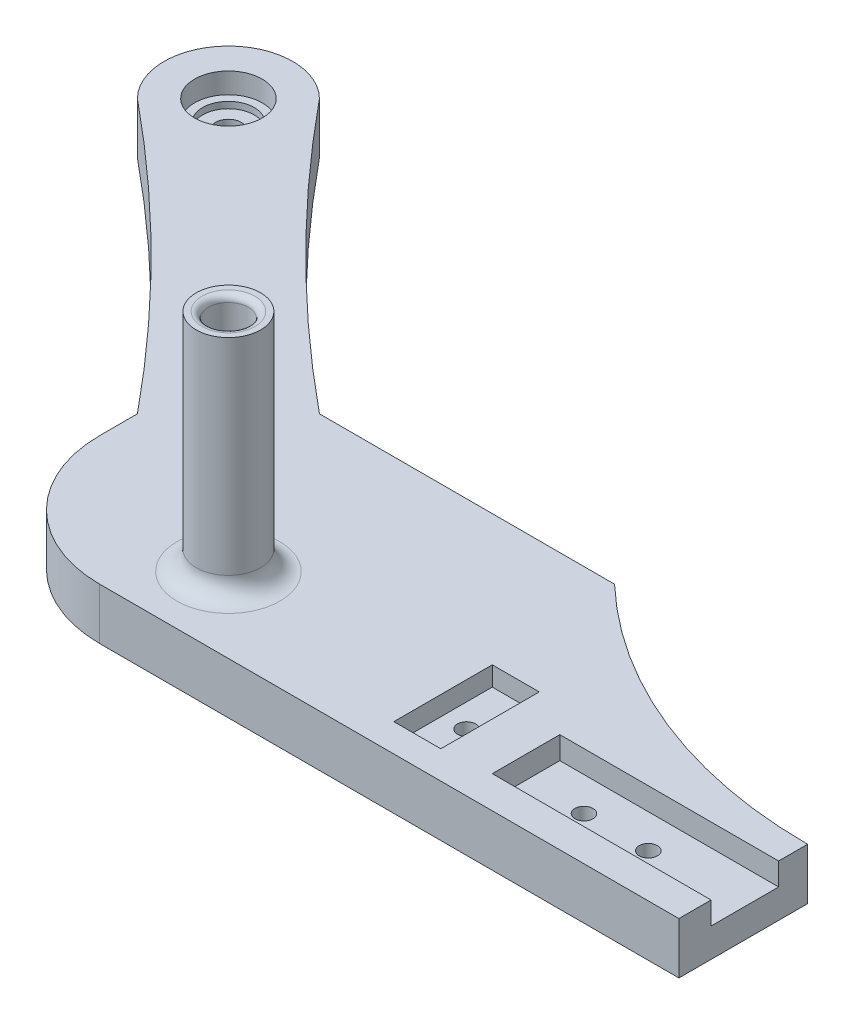
ISO-10303-21;
HEADER;
FILE_DESCRIPTION(('STEP AP214'),'2;1');
FILE_NAME('part.step','',(''),(''),'','','');
FILE_SCHEMA(('AUTOMOTIVE_DESIGN { 1 0 10303 214 1 1 1 1 }'));
ENDSEC;
DATA;
#1=APPLICATION_CONTEXT('core data for automotive mechanical design processes');
#2=APPLICATION_PROTOCOL_DEFINITION('international standard','automotive_design',2000,#1);
#3=PRODUCT_CONTEXT('',#1,'mechanical');
#4=PRODUCT('Part','Part','',(#3));
#5=PRODUCT_RELATED_PRODUCT_CATEGORY('part','',(#4));
#6=PRODUCT_DEFINITION_FORMATION('','',#4);
#7=PRODUCT_DEFINITION_CONTEXT('part definition',#1,'design');
#8=PRODUCT_DEFINITION('design','',#6,#7);
#9=PRODUCT_DEFINITION_SHAPE('','',#8);
#10=(LENGTH_UNIT() NAMED_UNIT(*) SI_UNIT(.MILLI.,.METRE.));
#11=(NAMED_UNIT(*) PLANE_ANGLE_UNIT() SI_UNIT($,.RADIAN.));
#12=(NAMED_UNIT(*) SI_UNIT($,.STERADIAN.) SOLID_ANGLE_UNIT());
#13=UNCERTAINTY_MEASURE_WITH_UNIT(LENGTH_MEASURE(1.E-05),#10,'distance_accuracy_value','');
#14=(GEOMETRIC_REPRESENTATION_CONTEXT(3) GLOBAL_UNCERTAINTY_ASSIGNED_CONTEXT((#13)) GLOBAL_UNIT_ASSIGNED_CONTEXT((#10,
#11,#12)) REPRESENTATION_CONTEXT('',''));
#15=CARTESIAN_POINT('',(0.,0.,0.));
#16=DIRECTION('',(0.,0.,1.));
#17=DIRECTION('',(1.,0.,0.));
#18=AXIS2_PLACEMENT_3D('',#15,#16,#17);
#19=CARTESIAN_POINT('',(-200.355339059327,8.,-55.3553390593275));
#20=DIRECTION('',(0.,1.,0.));
#21=DIRECTION('',(0.,0.,1.));
#22=AXIS2_PLACEMENT_3D('',#19,#20,#21);
#23=PLANE('',#22);
#24=DIRECTION('',(0.,0.,-1.));
#25=VECTOR('',#24,1.);
#26=CARTESIAN_POINT('',(-96.35,8.,15.65));
#27=LINE('',#26,#25);
#28=CARTESIAN_POINT('',(-96.35,8.,15.65));
#29=VERTEX_POINT('',#28);
#30=CARTESIAN_POINT('',(-96.35,8.,0.350000000000003));
#31=VERTEX_POINT('',#30);
#32=EDGE_CURVE('E56',#29,#31,#27,.T.);
#33=ORIENTED_EDGE('',*,*,#32,.F.);
#34=DIRECTION('',(1.,0.,0.));
#35=VECTOR('',#34,1.);
#36=CARTESIAN_POINT('',(-103.65,8.,15.65));
#37=LINE('',#36,#35);
#38=CARTESIAN_POINT('',(-103.65,8.,15.65));
#39=VERTEX_POINT('',#38);
#40=EDGE_CURVE('E184',#39,#29,#37,.T.);
#41=ORIENTED_EDGE('',*,*,#40,.F.);
#42=DIRECTION('',(0.,0.,1.));
#43=VECTOR('',#42,1.);
#44=CARTESIAN_POINT('',(-103.65,8.,15.65));
#45=LINE('',#44,#43);
#46=CARTESIAN_POINT('',(-103.65,8.,0.350000000000002));
#47=VERTEX_POINT('',#46);
#48=EDGE_CURVE('E188',#47,#39,#45,.T.);
#49=ORIENTED_EDGE('',*,*,#48,.F.);
#50=DIRECTION('',(-1.,0.,0.));
#51=VECTOR('',#50,1.);
#52=CARTESIAN_POINT('',(-103.65,8.,0.350000000000002));
#53=LINE('',#52,#51);
#54=EDGE_CURVE('E200',#31,#47,#53,.T.);
#55=ORIENTED_EDGE('',*,*,#54,.F.);
#56=EDGE_LOOP('',(#33,#41,#49,#55));
#57=FACE_BOUND('',#56,.T.);
#58=CARTESIAN_POINT('',(-136.715728752538,8.,8.28427124746194));
#59=DIRECTION('',(0.,1.,0.));
#60=DIRECTION('',(0.,0.,1.));
#61=AXIS2_PLACEMENT_3D('',#58,#59,#60);
#62=CIRCLE('',#61,8.00000000000002);
#63=CARTESIAN_POINT('',(-136.715728752538,8.,16.284271247462));
#64=VERTEX_POINT('',#63);
#65=EDGE_CURVE('E409',#64,#64,#62,.F.);
#66=ORIENTED_EDGE('',*,*,#65,.T.);
#67=EDGE_LOOP('',(#66));
#68=FACE_BOUND('',#67,.T.);
#69=DIRECTION('',(-1.,0.,0.));
#70=VECTOR('',#69,1.);
#71=CARTESIAN_POINT('',(-55.,8.,20.));
#72=LINE('',#71,#70);
#73=CARTESIAN_POINT('',(-55.,8.,20.));
#74=VERTEX_POINT('',#73);
#75=CARTESIAN_POINT('',(-145.,8.,20.));
#76=VERTEX_POINT('',#75);
#77=EDGE_CURVE('E334',#74,#76,#72,.T.);
#78=ORIENTED_EDGE('',*,*,#77,.F.);
#79=DIRECTION('',(0.,0.,1.));
#80=VECTOR('',#79,1.);
#81=CARTESIAN_POINT('',(-55.,8.,20.));
#82=LINE('',#81,#80);
#83=CARTESIAN_POINT('',(-55.,8.,15.));
#84=VERTEX_POINT('',#83);
#85=EDGE_CURVE('E335',#84,#74,#82,.T.);
#86=ORIENTED_EDGE('',*,*,#85,.F.);
#87=DIRECTION('',(-1.,0.,0.));
#88=VECTOR('',#87,1.);
#89=CARTESIAN_POINT('',(-55.,8.,15.));
#90=LINE('',#89,#88);
#91=CARTESIAN_POINT('',(-89.,8.,15.));
#92=VERTEX_POINT('',#91);
#93=EDGE_CURVE('E247',#84,#92,#90,.T.);
#94=ORIENTED_EDGE('',*,*,#93,.T.);
#95=DIRECTION('',(0.,0.,-1.));
#96=VECTOR('',#95,1.);
#97=CARTESIAN_POINT('',(-89.,8.,15.));
#98=LINE('',#97,#96);
#99=CARTESIAN_POINT('',(-89.,8.,4.5));
#100=VERTEX_POINT('',#99);
#101=EDGE_CURVE('E251',#92,#100,#98,.T.);
#102=ORIENTED_EDGE('',*,*,#101,.T.);
#103=DIRECTION('',(1.,0.,0.));
#104=VECTOR('',#103,1.);
#105=CARTESIAN_POINT('',(-55.,8.,4.5));
#106=LINE('',#105,#104);
#107=CARTESIAN_POINT('',(-55.,8.,4.5));
#108=VERTEX_POINT('',#107);
#109=EDGE_CURVE('E237',#100,#108,#106,.T.);
#110=ORIENTED_EDGE('',*,*,#109,.T.);
#111=CARTESIAN_POINT('',(-55.,8.,0.));
#112=VERTEX_POINT('',#111);
#113=EDGE_CURVE('E330',#112,#108,#82,.T.);
#114=ORIENTED_EDGE('',*,*,#113,.F.);
#115=CARTESIAN_POINT('',(-55.,8.,-72.5));
#116=DIRECTION('',(0.,-1.,0.));
#117=DIRECTION('',(0.,0.,-1.));
#118=AXIS2_PLACEMENT_3D('',#115,#116,#117);
#119=CIRCLE('',#118,72.5);
#120=CARTESIAN_POINT('',(-105.,8.,-20.));
#121=VERTEX_POINT('',#120);
#122=EDGE_CURVE('E262',#112,#121,#119,.T.);
#123=ORIENTED_EDGE('',*,*,#122,.T.);
#124=DIRECTION('',(1.,0.,0.));
#125=VECTOR('',#124,1.);
#126=CARTESIAN_POINT('',(-55.,8.,-20.));
#127=LINE('',#126,#125);
#128=CARTESIAN_POINT('',(-150.857864376269,8.,-20.));
#129=VERTEX_POINT('',#128);
#130=EDGE_CURVE('E347',#129,#121,#127,.T.);
#131=ORIENTED_EDGE('',*,*,#130,.F.);
#132=CARTESIAN_POINT('',(38.9976413801893,8.,-252.28191262765));
#133=DIRECTION('',(0.,-1.,0.));
#134=DIRECTION('',(0.,0.,-1.));
#135=AXIS2_PLACEMENT_3D('',#132,#133,#134);
#136=CIRCLE('',#135,300.);
#137=CARTESIAN_POINT('',(-193.284271247462,8.,-62.4264068711929));
#138=VERTEX_POINT('',#137);
#139=EDGE_CURVE('E318',#129,#138,#136,.T.);
#140=ORIENTED_EDGE('',*,*,#139,.T.);
#141=CARTESIAN_POINT('',(-200.355339059327,8.,-55.3553390593275));
#142=DIRECTION('',(0.,-1.,0.));
#143=DIRECTION('',(0.,0.,1.));
#144=AXIS2_PLACEMENT_3D('',#141,#142,#143);
#145=CIRCLE('',#144,10.);
#146=CARTESIAN_POINT('',(-207.426406871193,8.,-48.2842712474621));
#147=VERTEX_POINT('',#146);
#148=EDGE_CURVE('E343',#147,#138,#145,.T.);
#149=ORIENTED_EDGE('',*,*,#148,.F.);
#150=CARTESIAN_POINT('',(-397.281912627651,8.,183.997641380188));
#151=DIRECTION('',(0.,1.,0.));
#152=DIRECTION('',(-1.,0.,0.));
#153=AXIS2_PLACEMENT_3D('',#150,#151,#152);
#154=CIRCLE('',#153,300.);
#155=CARTESIAN_POINT('',(-165.,8.,-5.85786437626911));
#156=VERTEX_POINT('',#155);
#157=EDGE_CURVE('E310',#156,#147,#154,.T.);
#158=ORIENTED_EDGE('',*,*,#157,.F.);
#159=DIRECTION('',(0.,0.,-1.));
#160=VECTOR('',#159,1.);
#161=CARTESIAN_POINT('',(-165.,8.,20.));
#162=LINE('',#161,#160);
#163=CARTESIAN_POINT('',(-165.,8.,0.));
#164=VERTEX_POINT('',#163);
#165=EDGE_CURVE('E339',#164,#156,#162,.T.);
#166=ORIENTED_EDGE('',*,*,#165,.F.);
#167=CARTESIAN_POINT('',(-145.,8.,0.));
#168=DIRECTION('',(0.,-1.,0.));
#169=DIRECTION('',(0.,0.,1.));
#170=AXIS2_PLACEMENT_3D('',#167,#168,#169);
#171=CIRCLE('',#170,20.);
#172=EDGE_CURVE('E396',#76,#164,#171,.T.);
#173=ORIENTED_EDGE('',*,*,#172,.F.);
#174=EDGE_LOOP('',(#78,#86,#94,#102,#110,#114,#123,#131,#140,#149,#158,#166,#173));
#175=FACE_BOUND('',#174,.T.);
#176=CARTESIAN_POINT('',(-200.355339059327,8.,-55.3553390593275));
#177=DIRECTION('',(0.,-1.,0.));
#178=DIRECTION('',(0.,0.,1.));
#179=AXIS2_PLACEMENT_3D('',#176,#177,#178);
#180=CIRCLE('',#179,5.24999999999999);
#181=CARTESIAN_POINT('',(-200.355339059327,8.,-50.1053390593275));
#182=VERTEX_POINT('',#181);
#183=EDGE_CURVE('E302',#182,#182,#180,.T.);
#184=ORIENTED_EDGE('',*,*,#183,.T.);
#185=EDGE_LOOP('',(#184));
#186=FACE_BOUND('',#185,.T.);
#187=ADVANCED_FACE('F40',(#57,#68,#175,#186),#23,.T.);
#188=CARTESIAN_POINT('',(-200.355339059327,0.,-55.3553390593275));
#189=DIRECTION('',(0.,1.,0.));
#190=DIRECTION('',(0.,0.,1.));
#191=AXIS2_PLACEMENT_3D('',#188,#189,#190);
#192=PLANE('',#191);
#193=CARTESIAN_POINT('',(-100.,0.,8.));
#194=DIRECTION('',(0.,1.,0.));
#195=DIRECTION('',(0.,0.,1.));
#196=AXIS2_PLACEMENT_3D('',#193,#194,#195);
#197=CIRCLE('',#196,1.4);
#198=CARTESIAN_POINT('',(-100.,0.,9.40000000000001));
#199=VERTEX_POINT('',#198);
#200=EDGE_CURVE('E201',#199,#199,#197,.T.);
#201=ORIENTED_EDGE('',*,*,#200,.T.);
#202=EDGE_LOOP('',(#201));
#203=FACE_BOUND('',#202,.T.);
#204=CARTESIAN_POINT('',(-136.715728752538,0.,8.28427124746194));
#205=DIRECTION('',(0.,1.,0.));
#206=DIRECTION('',(0.,0.,1.));
#207=AXIS2_PLACEMENT_3D('',#204,#205,#206);
#208=CIRCLE('',#207,3.09999999999999);
#209=CARTESIAN_POINT('',(-136.715728752538,0.,11.3842712474619));
#210=VERTEX_POINT('',#209);
#211=EDGE_CURVE('E219',#210,#210,#208,.T.);
#212=ORIENTED_EDGE('',*,*,#211,.T.);
#213=EDGE_LOOP('',(#212));
#214=FACE_BOUND('',#213,.T.);
#215=CARTESIAN_POINT('',(-70.,0.,9.75));
#216=DIRECTION('',(0.,-1.,0.));
#217=DIRECTION('',(0.,0.,1.));
#218=AXIS2_PLACEMENT_3D('',#215,#216,#217);
#219=CIRCLE('',#218,1.4);
#220=CARTESIAN_POINT('',(-70.,0.,11.15));
#221=VERTEX_POINT('',#220);
#222=EDGE_CURVE('E224',#221,#221,#219,.T.);
#223=ORIENTED_EDGE('',*,*,#222,.F.);
#224=EDGE_LOOP('',(#223));
#225=FACE_BOUND('',#224,.T.);
#226=CARTESIAN_POINT('',(-80.,0.,9.75));
#227=DIRECTION('',(0.,-1.,0.));
#228=DIRECTION('',(0.,0.,1.));
#229=AXIS2_PLACEMENT_3D('',#226,#227,#228);
#230=CIRCLE('',#229,1.4);
#231=CARTESIAN_POINT('',(-80.,0.,11.15));
#232=VERTEX_POINT('',#231);
#233=EDGE_CURVE('E223',#232,#232,#230,.T.);
#234=ORIENTED_EDGE('',*,*,#233,.F.);
#235=EDGE_LOOP('',(#234));
#236=FACE_BOUND('',#235,.T.);
#237=CARTESIAN_POINT('',(-200.355339059327,0.,-55.3553390593275));
#238=DIRECTION('',(0.,1.,0.));
#239=DIRECTION('',(0.,0.,-1.));
#240=AXIS2_PLACEMENT_3D('',#237,#238,#239);
#241=CIRCLE('',#240,4.99999999999999);
#242=CARTESIAN_POINT('',(-200.355339059327,0.,-60.3553390593275));
#243=VERTEX_POINT('',#242);
#244=EDGE_CURVE('E289',#243,#243,#241,.T.);
#245=ORIENTED_EDGE('',*,*,#244,.T.);
#246=EDGE_LOOP('',(#245));
#247=FACE_BOUND('',#246,.T.);
#248=DIRECTION('',(0.,0.,-1.));
#249=VECTOR('',#248,1.);
#250=CARTESIAN_POINT('',(-165.,0.,20.));
#251=LINE('',#250,#249);
#252=CARTESIAN_POINT('',(-165.,0.,0.));
#253=VERTEX_POINT('',#252);
#254=CARTESIAN_POINT('',(-165.,0.,-5.85786437626909));
#255=VERTEX_POINT('',#254);
#256=EDGE_CURVE('E359',#253,#255,#251,.T.);
#257=ORIENTED_EDGE('',*,*,#256,.T.);
#258=CARTESIAN_POINT('',(-397.281912627651,0.,183.997641380188));
#259=DIRECTION('',(0.,1.,0.));
#260=DIRECTION('',(-1.,0.,0.));
#261=AXIS2_PLACEMENT_3D('',#258,#259,#260);
#262=CIRCLE('',#261,300.);
#263=CARTESIAN_POINT('',(-207.426406871193,0.,-48.2842712474621));
#264=VERTEX_POINT('',#263);
#265=EDGE_CURVE('E314',#255,#264,#262,.T.);
#266=ORIENTED_EDGE('',*,*,#265,.T.);
#267=CARTESIAN_POINT('',(-200.355339059327,0.,-55.3553390593275));
#268=DIRECTION('',(0.,-1.,0.));
#269=DIRECTION('',(0.,0.,1.));
#270=AXIS2_PLACEMENT_3D('',#267,#268,#269);
#271=CIRCLE('',#270,10.);
#272=CARTESIAN_POINT('',(-193.284271247462,0.,-62.4264068711929));
#273=VERTEX_POINT('',#272);
#274=EDGE_CURVE('E363',#264,#273,#271,.T.);
#275=ORIENTED_EDGE('',*,*,#274,.T.);
#276=CARTESIAN_POINT('',(38.9976413801893,0.,-252.28191262765));
#277=DIRECTION('',(0.,-1.,0.));
#278=DIRECTION('',(0.,0.,-1.));
#279=AXIS2_PLACEMENT_3D('',#276,#277,#278);
#280=CIRCLE('',#279,300.);
#281=CARTESIAN_POINT('',(-150.857864376269,0.,-20.));
#282=VERTEX_POINT('',#281);
#283=EDGE_CURVE('E322',#282,#273,#280,.T.);
#284=ORIENTED_EDGE('',*,*,#283,.F.);
#285=DIRECTION('',(1.,0.,0.));
#286=VECTOR('',#285,1.);
#287=CARTESIAN_POINT('',(-55.,0.,-20.));
#288=LINE('',#287,#286);
#289=CARTESIAN_POINT('',(-105.,0.,-20.));
#290=VERTEX_POINT('',#289);
#291=EDGE_CURVE('E367',#282,#290,#288,.T.);
#292=ORIENTED_EDGE('',*,*,#291,.T.);
#293=CARTESIAN_POINT('',(-55.,0.,-72.5));
#294=DIRECTION('',(0.,-1.,0.));
#295=DIRECTION('',(0.,0.,-1.));
#296=AXIS2_PLACEMENT_3D('',#293,#294,#295);
#297=CIRCLE('',#296,72.5);
#298=CARTESIAN_POINT('',(-55.,0.,0.));
#299=VERTEX_POINT('',#298);
#300=EDGE_CURVE('E271',#299,#290,#297,.T.);
#301=ORIENTED_EDGE('',*,*,#300,.F.);
#302=DIRECTION('',(0.,0.,1.));
#303=VECTOR('',#302,1.);
#304=CARTESIAN_POINT('',(-55.,0.,20.));
#305=LINE('',#304,#303);
#306=CARTESIAN_POINT('',(-55.,0.,20.));
#307=VERTEX_POINT('',#306);
#308=EDGE_CURVE('E326',#299,#307,#305,.T.);
#309=ORIENTED_EDGE('',*,*,#308,.T.);
#310=DIRECTION('',(-1.,0.,0.));
#311=VECTOR('',#310,1.);
#312=CARTESIAN_POINT('',(-55.,0.,20.));
#313=LINE('',#312,#311);
#314=CARTESIAN_POINT('',(-145.,0.,20.));
#315=VERTEX_POINT('',#314);
#316=EDGE_CURVE('E355',#307,#315,#313,.T.);
#317=ORIENTED_EDGE('',*,*,#316,.T.);
#318=CARTESIAN_POINT('',(-145.,0.,0.));
#319=DIRECTION('',(0.,-1.,0.));
#320=DIRECTION('',(0.,0.,1.));
#321=AXIS2_PLACEMENT_3D('',#318,#319,#320);
#322=CIRCLE('',#321,20.);
#323=EDGE_CURVE('E391',#253,#315,#322,.F.);
#324=ORIENTED_EDGE('',*,*,#323,.F.);
#325=EDGE_LOOP('',(#257,#266,#275,#284,#292,#301,#309,#317,#324));
#326=FACE_BOUND('',#325,.T.);
#327=ADVANCED_FACE('F432',(#203,#214,#225,#236,#247,#326),#192,.F.);
#328=CARTESIAN_POINT('',(-55.,8.,20.));
#329=DIRECTION('',(-1.,0.,0.));
#330=DIRECTION('',(0.,0.,-1.));
#331=AXIS2_PLACEMENT_3D('',#328,#329,#330);
#332=PLANE('',#331);
#333=DIRECTION('',(0.,0.,1.));
#334=VECTOR('',#333,1.);
#335=CARTESIAN_POINT('',(-55.,4.5,15.));
#336=LINE('',#335,#334);
#337=CARTESIAN_POINT('',(-55.,4.5,4.5));
#338=VERTEX_POINT('',#337);
#339=CARTESIAN_POINT('',(-55.,4.5,15.));
#340=VERTEX_POINT('',#339);
#341=EDGE_CURVE('E232',#338,#340,#336,.T.);
#342=ORIENTED_EDGE('',*,*,#341,.T.);
#343=DIRECTION('',(0.,1.,0.));
#344=VECTOR('',#343,1.);
#345=CARTESIAN_POINT('',(-55.,4.5,15.));
#346=LINE('',#345,#344);
#347=EDGE_CURVE('E246',#340,#84,#346,.T.);
#348=ORIENTED_EDGE('',*,*,#347,.T.);
#349=ORIENTED_EDGE('',*,*,#85,.T.);
#350=DIRECTION('',(0.,-1.,0.));
#351=VECTOR('',#350,1.);
#352=CARTESIAN_POINT('',(-55.,8.,20.));
#353=LINE('',#352,#351);
#354=EDGE_CURVE('E382',#74,#307,#353,.T.);
#355=ORIENTED_EDGE('',*,*,#354,.T.);
#356=ORIENTED_EDGE('',*,*,#308,.F.);
#357=DIRECTION('',(0.,1.,0.));
#358=VECTOR('',#357,1.);
#359=CARTESIAN_POINT('',(-55.,0.,0.));
#360=LINE('',#359,#358);
#361=EDGE_CURVE('E279',#299,#112,#360,.T.);
#362=ORIENTED_EDGE('',*,*,#361,.T.);
#363=ORIENTED_EDGE('',*,*,#113,.T.);
#364=DIRECTION('',(0.,1.,0.));
#365=VECTOR('',#364,1.);
#366=CARTESIAN_POINT('',(-55.,4.5,4.5));
#367=LINE('',#366,#365);
#368=EDGE_CURVE('E259',#338,#108,#367,.T.);
#369=ORIENTED_EDGE('',*,*,#368,.F.);
#370=EDGE_LOOP('',(#342,#348,#349,#355,#356,#362,#363,#369));
#371=FACE_BOUND('',#370,.T.);
#372=ADVANCED_FACE('F439',(#371),#332,.F.);
#373=CARTESIAN_POINT('',(-55.,8.,20.));
#374=DIRECTION('',(0.,0.,-1.));
#375=DIRECTION('',(1.,0.,0.));
#376=AXIS2_PLACEMENT_3D('',#373,#374,#375);
#377=PLANE('',#376);
#378=ORIENTED_EDGE('',*,*,#316,.F.);
#379=ORIENTED_EDGE('',*,*,#354,.F.);
#380=ORIENTED_EDGE('',*,*,#77,.T.);
#381=DIRECTION('',(0.,-1.,0.));
#382=VECTOR('',#381,1.);
#383=CARTESIAN_POINT('',(-145.,8.,20.));
#384=LINE('',#383,#382);
#385=EDGE_CURVE('E64',#315,#76,#384,.F.);
#386=ORIENTED_EDGE('',*,*,#385,.F.);
#387=EDGE_LOOP('',(#378,#379,#380,#386));
#388=FACE_BOUND('',#387,.T.);
#389=ADVANCED_FACE('F458',(#388),#377,.F.);
#390=CARTESIAN_POINT('',(-165.,8.,20.));
#391=DIRECTION('',(1.,0.,0.));
#392=DIRECTION('',(0.,0.,1.));
#393=AXIS2_PLACEMENT_3D('',#390,#391,#392);
#394=PLANE('',#393);
#395=ORIENTED_EDGE('',*,*,#165,.T.);
#396=DIRECTION('',(0.,-1.,0.));
#397=VECTOR('',#396,1.);
#398=CARTESIAN_POINT('',(-165.,8.,-5.85786437626909));
#399=LINE('',#398,#397);
#400=EDGE_CURVE('E379',#156,#255,#399,.T.);
#401=ORIENTED_EDGE('',*,*,#400,.T.);
#402=ORIENTED_EDGE('',*,*,#256,.F.);
#403=DIRECTION('',(0.,-1.,0.));
#404=VECTOR('',#403,1.);
#405=CARTESIAN_POINT('',(-165.,8.,0.));
#406=LINE('',#405,#404);
#407=EDGE_CURVE('E385',#164,#253,#406,.T.);
#408=ORIENTED_EDGE('',*,*,#407,.F.);
#409=EDGE_LOOP('',(#395,#401,#402,#408));
#410=FACE_BOUND('',#409,.T.);
#411=ADVANCED_FACE('F454',(#410),#394,.F.);
#412=CARTESIAN_POINT('',(-200.355339059327,8.,-55.3553390593275));
#413=DIRECTION('',(0.,-1.,0.));
#414=DIRECTION('',(0.,0.,-1.));
#415=AXIS2_PLACEMENT_3D('',#412,#413,#414);
#416=CYLINDRICAL_SURFACE('',#415,10.);
#417=ORIENTED_EDGE('',*,*,#274,.F.);
#418=DIRECTION('',(0.,-1.,0.));
#419=VECTOR('',#418,1.);
#420=CARTESIAN_POINT('',(-207.426406871193,8.,-48.284271247462));
#421=LINE('',#420,#419);
#422=EDGE_CURVE('E376',#147,#264,#421,.T.);
#423=ORIENTED_EDGE('',*,*,#422,.F.);
#424=ORIENTED_EDGE('',*,*,#148,.T.);
#425=DIRECTION('',(0.,-1.,0.));
#426=VECTOR('',#425,1.);
#427=CARTESIAN_POINT('',(-193.284271247462,8.,-62.4264068711929));
#428=LINE('',#427,#426);
#429=EDGE_CURVE('E373',#138,#273,#428,.T.);
#430=ORIENTED_EDGE('',*,*,#429,.T.);
#431=EDGE_LOOP('',(#417,#423,#424,#430));
#432=FACE_BOUND('',#431,.T.);
#433=ADVANCED_FACE('F450',(#432),#416,.T.);
#434=CARTESIAN_POINT('',(-55.,8.,-20.));
#435=DIRECTION('',(0.,0.,1.));
#436=DIRECTION('',(-1.,0.,0.));
#437=AXIS2_PLACEMENT_3D('',#434,#435,#436);
#438=PLANE('',#437);
#439=ORIENTED_EDGE('',*,*,#291,.F.);
#440=DIRECTION('',(0.,-1.,0.));
#441=VECTOR('',#440,1.);
#442=CARTESIAN_POINT('',(-150.857864376269,8.,-20.));
#443=LINE('',#442,#441);
#444=EDGE_CURVE('E351',#129,#282,#443,.T.);
#445=ORIENTED_EDGE('',*,*,#444,.F.);
#446=ORIENTED_EDGE('',*,*,#130,.T.);
#447=DIRECTION('',(0.,1.,0.));
#448=VECTOR('',#447,1.);
#449=CARTESIAN_POINT('',(-105.,0.,-20.));
#450=LINE('',#449,#448);
#451=EDGE_CURVE('E275',#290,#121,#450,.T.);
#452=ORIENTED_EDGE('',*,*,#451,.F.);
#453=EDGE_LOOP('',(#439,#445,#446,#452));
#454=FACE_BOUND('',#453,.T.);
#455=ADVANCED_FACE('F447',(#454),#438,.F.);
#456=CARTESIAN_POINT('',(38.9976413801893,0.,-252.28191262765));
#457=DIRECTION('',(0.,1.,0.));
#458=DIRECTION('',(0.,0.,1.));
#459=AXIS2_PLACEMENT_3D('',#456,#457,#458);
#460=CYLINDRICAL_SURFACE('',#459,300.);
#461=ORIENTED_EDGE('',*,*,#139,.F.);
#462=ORIENTED_EDGE('',*,*,#444,.T.);
#463=ORIENTED_EDGE('',*,*,#283,.T.);
#464=ORIENTED_EDGE('',*,*,#429,.F.);
#465=EDGE_LOOP('',(#461,#462,#463,#464));
#466=FACE_BOUND('',#465,.T.);
#467=ADVANCED_FACE('F444',(#466),#460,.F.);
#468=CARTESIAN_POINT('',(-397.281912627651,0.,183.997641380188));
#469=DIRECTION('',(0.,1.,0.));
#470=DIRECTION('',(0.,0.,1.));
#471=AXIS2_PLACEMENT_3D('',#468,#469,#470);
#472=CYLINDRICAL_SURFACE('',#471,300.);
#473=ORIENTED_EDGE('',*,*,#157,.T.);
#474=ORIENTED_EDGE('',*,*,#422,.T.);
#475=ORIENTED_EDGE('',*,*,#265,.F.);
#476=ORIENTED_EDGE('',*,*,#400,.F.);
#477=EDGE_LOOP('',(#473,#474,#475,#476));
#478=FACE_BOUND('',#477,.T.);
#479=ADVANCED_FACE('F522',(#478),#472,.F.);
#480=CARTESIAN_POINT('',(-200.355339059327,4.8,-55.3553390593275));
#481=DIRECTION('',(0.,1.,0.));
#482=DIRECTION('',(0.,0.,1.));
#483=AXIS2_PLACEMENT_3D('',#480,#481,#482);
#484=PLANE('',#483);
#485=CARTESIAN_POINT('',(-200.355339059327,4.8,-55.3553390593275));
#486=DIRECTION('',(0.,-1.,0.));
#487=DIRECTION('',(0.,0.,1.));
#488=AXIS2_PLACEMENT_3D('',#485,#486,#487);
#489=CIRCLE('',#488,4.00000000000001);
#490=CARTESIAN_POINT('',(-200.355339059327,4.8,-51.3553390593275));
#491=VERTEX_POINT('',#490);
#492=EDGE_CURVE('E294',#491,#491,#489,.T.);
#493=ORIENTED_EDGE('',*,*,#492,.T.);
#494=EDGE_LOOP('',(#493));
#495=FACE_BOUND('',#494,.T.);
#496=CARTESIAN_POINT('',(-200.355339059327,4.8,-55.3553390593275));
#497=DIRECTION('',(0.,-1.,0.));
#498=DIRECTION('',(0.,0.,1.));
#499=AXIS2_PLACEMENT_3D('',#496,#497,#498);
#500=CIRCLE('',#499,5.24999999999999);
#501=CARTESIAN_POINT('',(-200.355339059327,4.8,-50.1053390593275));
#502=VERTEX_POINT('',#501);
#503=EDGE_CURVE('E306',#502,#502,#500,.T.);
#504=ORIENTED_EDGE('',*,*,#503,.F.);
#505=EDGE_LOOP('',(#504));
#506=FACE_BOUND('',#505,.T.);
#507=ADVANCED_FACE('F524',(#495,#506),#484,.T.);
#508=CARTESIAN_POINT('',(-200.355339059327,4.8,-55.3553390593275));
#509=DIRECTION('',(0.,1.,0.));
#510=DIRECTION('',(0.,0.,1.));
#511=AXIS2_PLACEMENT_3D('',#508,#509,#510);
#512=CYLINDRICAL_SURFACE('',#511,5.24999999999999);
#513=ORIENTED_EDGE('',*,*,#503,.T.);
#514=EDGE_LOOP('',(#513));
#515=FACE_BOUND('',#514,.T.);
#516=ORIENTED_EDGE('',*,*,#183,.F.);
#517=EDGE_LOOP('',(#516));
#518=FACE_BOUND('',#517,.T.);
#519=ADVANCED_FACE('F529',(#515,#518),#512,.F.);
#520=CARTESIAN_POINT('',(-200.355339059327,3.8,-55.3553390593275));
#521=DIRECTION('',(0.,1.,0.));
#522=DIRECTION('',(0.,0.,1.));
#523=AXIS2_PLACEMENT_3D('',#520,#521,#522);
#524=PLANE('',#523);
#525=CARTESIAN_POINT('',(-200.355339059327,3.8,-55.3553390593275));
#526=DIRECTION('',(0.,-1.,0.));
#527=DIRECTION('',(0.,0.,1.));
#528=AXIS2_PLACEMENT_3D('',#525,#526,#527);
#529=CIRCLE('',#528,2.);
#530=CARTESIAN_POINT('',(-200.355339059327,3.8,-53.3553390593275));
#531=VERTEX_POINT('',#530);
#532=EDGE_CURVE('E285',#531,#531,#529,.T.);
#533=ORIENTED_EDGE('',*,*,#532,.T.);
#534=EDGE_LOOP('',(#533));
#535=FACE_BOUND('',#534,.T.);
#536=CARTESIAN_POINT('',(-200.355339059327,3.8,-55.3553390593275));
#537=DIRECTION('',(0.,-1.,0.));
#538=DIRECTION('',(0.,0.,1.));
#539=AXIS2_PLACEMENT_3D('',#536,#537,#538);
#540=CIRCLE('',#539,4.00000000000001);
#541=CARTESIAN_POINT('',(-200.355339059327,3.8,-51.3553390593275));
#542=VERTEX_POINT('',#541);
#543=EDGE_CURVE('E298',#542,#542,#540,.T.);
#544=ORIENTED_EDGE('',*,*,#543,.F.);
#545=EDGE_LOOP('',(#544));
#546=FACE_BOUND('',#545,.T.);
#547=ADVANCED_FACE('F534',(#535,#546),#524,.T.);
#548=CARTESIAN_POINT('',(-200.355339059327,3.8,-55.3553390593275));
#549=DIRECTION('',(0.,1.,0.));
#550=DIRECTION('',(0.,0.,1.));
#551=AXIS2_PLACEMENT_3D('',#548,#549,#550);
#552=CYLINDRICAL_SURFACE('',#551,4.00000000000001);
#553=ORIENTED_EDGE('',*,*,#543,.T.);
#554=EDGE_LOOP('',(#553));
#555=FACE_BOUND('',#554,.T.);
#556=ORIENTED_EDGE('',*,*,#492,.F.);
#557=EDGE_LOOP('',(#556));
#558=FACE_BOUND('',#557,.T.);
#559=ADVANCED_FACE('F537',(#555,#558),#552,.F.);
#560=CARTESIAN_POINT('',(-200.355339059327,2.,-55.3553390593275));
#561=DIRECTION('',(0.,-1.,0.));
#562=DIRECTION('',(0.,0.,-1.));
#563=AXIS2_PLACEMENT_3D('',#560,#561,#562);
#564=PLANE('',#563);
#565=CARTESIAN_POINT('',(-200.355339059327,2.,-55.3553390593275));
#566=DIRECTION('',(0.,1.,0.));
#567=DIRECTION('',(0.,0.,-1.));
#568=AXIS2_PLACEMENT_3D('',#565,#566,#567);
#569=CIRCLE('',#568,2.);
#570=CARTESIAN_POINT('',(-200.355339059327,2.,-57.3553390593275));
#571=VERTEX_POINT('',#570);
#572=EDGE_CURVE('E282',#571,#571,#569,.T.);
#573=ORIENTED_EDGE('',*,*,#572,.T.);
#574=EDGE_LOOP('',(#573));
#575=FACE_BOUND('',#574,.T.);
#576=CARTESIAN_POINT('',(-200.355339059327,2.,-55.3553390593275));
#577=DIRECTION('',(0.,1.,0.));
#578=DIRECTION('',(0.,0.,-1.));
#579=AXIS2_PLACEMENT_3D('',#576,#577,#578);
#580=CIRCLE('',#579,4.99999999999999);
#581=CARTESIAN_POINT('',(-200.355339059327,2.,-60.3553390593275));
#582=VERTEX_POINT('',#581);
#583=EDGE_CURVE('E290',#582,#582,#580,.T.);
#584=ORIENTED_EDGE('',*,*,#583,.F.);
#585=EDGE_LOOP('',(#584));
#586=FACE_BOUND('',#585,.T.);
#587=ADVANCED_FACE('F540',(#575,#586),#564,.T.);
#588=CARTESIAN_POINT('',(-200.355339059327,2.,-55.3553390593275));
#589=DIRECTION('',(0.,-1.,0.));
#590=DIRECTION('',(0.,0.,-1.));
#591=AXIS2_PLACEMENT_3D('',#588,#589,#590);
#592=CYLINDRICAL_SURFACE('',#591,4.99999999999999);
#593=ORIENTED_EDGE('',*,*,#583,.T.);
#594=EDGE_LOOP('',(#593));
#595=FACE_BOUND('',#594,.T.);
#596=ORIENTED_EDGE('',*,*,#244,.F.);
#597=EDGE_LOOP('',(#596));
#598=FACE_BOUND('',#597,.T.);
#599=ADVANCED_FACE('F545',(#595,#598),#592,.F.);
#600=CARTESIAN_POINT('',(-200.355339059327,0.,-55.3553390593275));
#601=DIRECTION('',(0.,1.,0.));
#602=DIRECTION('',(0.,0.,1.));
#603=AXIS2_PLACEMENT_3D('',#600,#601,#602);
#604=CYLINDRICAL_SURFACE('',#603,2.);
#605=ORIENTED_EDGE('',*,*,#532,.F.);
#606=EDGE_LOOP('',(#605));
#607=FACE_BOUND('',#606,.T.);
#608=ORIENTED_EDGE('',*,*,#572,.F.);
#609=EDGE_LOOP('',(#608));
#610=FACE_BOUND('',#609,.T.);
#611=ADVANCED_FACE('F548',(#607,#610),#604,.F.);
#612=CARTESIAN_POINT('',(-136.715728752538,43.,8.28427124746194));
#613=DIRECTION('',(0.,1.,0.));
#614=DIRECTION('',(0.,0.,1.));
#615=AXIS2_PLACEMENT_3D('',#612,#613,#614);
#616=PLANE('',#615);
#617=CARTESIAN_POINT('',(-136.715728752538,43.,8.28427124746194));
#618=DIRECTION('',(0.,1.,0.));
#619=DIRECTION('',(0.,0.,1.));
#620=AXIS2_PLACEMENT_3D('',#617,#618,#619);
#621=CIRCLE('',#620,4.09999999999999);
#622=CARTESIAN_POINT('',(-136.715728752538,43.,12.3842712474619));
#623=VERTEX_POINT('',#622);
#624=EDGE_CURVE('E11',#623,#623,#621,.F.);
#625=ORIENTED_EDGE('',*,*,#624,.T.);
#626=EDGE_LOOP('',(#625));
#627=FACE_BOUND('',#626,.T.);
#628=CARTESIAN_POINT('',(-136.715728752538,43.,8.28427124746194));
#629=DIRECTION('',(0.,1.,0.));
#630=DIRECTION('',(0.,0.,1.));
#631=AXIS2_PLACEMENT_3D('',#628,#629,#630);
#632=CIRCLE('',#631,5.00000000000002);
#633=CARTESIAN_POINT('',(-136.715728752538,43.,13.284271247462));
#634=VERTEX_POINT('',#633);
#635=EDGE_CURVE('E210',#634,#634,#632,.T.);
#636=ORIENTED_EDGE('',*,*,#635,.T.);
#637=EDGE_LOOP('',(#636));
#638=FACE_BOUND('',#637,.T.);
#639=ADVANCED_FACE('F555',(#627,#638),#616,.T.);
#640=CARTESIAN_POINT('',(-55.,0.,-72.5));
#641=DIRECTION('',(0.,1.,0.));
#642=DIRECTION('',(0.,0.,1.));
#643=AXIS2_PLACEMENT_3D('',#640,#641,#642);
#644=CYLINDRICAL_SURFACE('',#643,72.5);
#645=ORIENTED_EDGE('',*,*,#122,.F.);
#646=ORIENTED_EDGE('',*,*,#361,.F.);
#647=ORIENTED_EDGE('',*,*,#300,.T.);
#648=ORIENTED_EDGE('',*,*,#451,.T.);
#649=EDGE_LOOP('',(#645,#646,#647,#648));
#650=FACE_BOUND('',#649,.T.);
#651=ADVANCED_FACE('F514',(#650),#644,.F.);
#652=CARTESIAN_POINT('',(-55.,4.5,4.5));
#653=DIRECTION('',(0.,0.,-1.));
#654=DIRECTION('',(1.,0.,0.));
#655=AXIS2_PLACEMENT_3D('',#652,#653,#654);
#656=PLANE('',#655);
#657=ORIENTED_EDGE('',*,*,#109,.F.);
#658=DIRECTION('',(0.,1.,0.));
#659=VECTOR('',#658,1.);
#660=CARTESIAN_POINT('',(-89.,4.5,4.5));
#661=LINE('',#660,#659);
#662=CARTESIAN_POINT('',(-89.,4.5,4.5));
#663=VERTEX_POINT('',#662);
#664=EDGE_CURVE('E263',#663,#100,#661,.T.);
#665=ORIENTED_EDGE('',*,*,#664,.F.);
#666=DIRECTION('',(1.,0.,0.));
#667=VECTOR('',#666,1.);
#668=CARTESIAN_POINT('',(-55.,4.5,4.5));
#669=LINE('',#668,#667);
#670=EDGE_CURVE('E243',#663,#338,#669,.T.);
#671=ORIENTED_EDGE('',*,*,#670,.T.);
#672=ORIENTED_EDGE('',*,*,#368,.T.);
#673=EDGE_LOOP('',(#657,#665,#671,#672));
#674=FACE_BOUND('',#673,.T.);
#675=ADVANCED_FACE('F510',(#674),#656,.F.);
#676=CARTESIAN_POINT('',(-89.,4.5,15.));
#677=DIRECTION('',(-1.,0.,0.));
#678=DIRECTION('',(0.,0.,-1.));
#679=AXIS2_PLACEMENT_3D('',#676,#677,#678);
#680=PLANE('',#679);
#681=ORIENTED_EDGE('',*,*,#101,.F.);
#682=DIRECTION('',(0.,1.,0.));
#683=VECTOR('',#682,1.);
#684=CARTESIAN_POINT('',(-89.,4.5,15.));
#685=LINE('',#684,#683);
#686=CARTESIAN_POINT('',(-89.,4.5,15.));
#687=VERTEX_POINT('',#686);
#688=EDGE_CURVE('E266',#687,#92,#685,.T.);
#689=ORIENTED_EDGE('',*,*,#688,.F.);
#690=DIRECTION('',(0.,0.,-1.));
#691=VECTOR('',#690,1.);
#692=CARTESIAN_POINT('',(-89.,4.5,15.));
#693=LINE('',#692,#691);
#694=EDGE_CURVE('E240',#687,#663,#693,.T.);
#695=ORIENTED_EDGE('',*,*,#694,.T.);
#696=ORIENTED_EDGE('',*,*,#664,.T.);
#697=EDGE_LOOP('',(#681,#689,#695,#696));
#698=FACE_BOUND('',#697,.T.);
#699=ADVANCED_FACE('F505',(#698),#680,.F.);
#700=CARTESIAN_POINT('',(-55.,4.5,15.));
#701=DIRECTION('',(0.,0.,1.));
#702=DIRECTION('',(-1.,0.,0.));
#703=AXIS2_PLACEMENT_3D('',#700,#701,#702);
#704=PLANE('',#703);
#705=ORIENTED_EDGE('',*,*,#93,.F.);
#706=ORIENTED_EDGE('',*,*,#347,.F.);
#707=DIRECTION('',(-1.,0.,0.));
#708=VECTOR('',#707,1.);
#709=CARTESIAN_POINT('',(-55.,4.5,15.));
#710=LINE('',#709,#708);
#711=EDGE_CURVE('E236',#340,#687,#710,.T.);
#712=ORIENTED_EDGE('',*,*,#711,.T.);
#713=ORIENTED_EDGE('',*,*,#688,.T.);
#714=EDGE_LOOP('',(#705,#706,#712,#713));
#715=FACE_BOUND('',#714,.T.);
#716=ADVANCED_FACE('F477',(#715),#704,.F.);
#717=CARTESIAN_POINT('',(-110.,4.5,0.));
#718=DIRECTION('',(0.,-1.,0.));
#719=DIRECTION('',(0.,0.,-1.));
#720=AXIS2_PLACEMENT_3D('',#717,#718,#719);
#721=PLANE('',#720);
#722=CARTESIAN_POINT('',(-70.,4.5,9.75));
#723=DIRECTION('',(0.,1.,0.));
#724=DIRECTION('',(0.,0.,-1.));
#725=AXIS2_PLACEMENT_3D('',#722,#723,#724);
#726=CIRCLE('',#725,1.4);
#727=CARTESIAN_POINT('',(-70.,4.5,8.35000000000001));
#728=VERTEX_POINT('',#727);
#729=EDGE_CURVE('E252',#728,#728,#726,.T.);
#730=ORIENTED_EDGE('',*,*,#729,.F.);
#731=EDGE_LOOP('',(#730));
#732=FACE_BOUND('',#731,.T.);
#733=CARTESIAN_POINT('',(-80.,4.5,9.75));
#734=DIRECTION('',(0.,1.,0.));
#735=DIRECTION('',(0.,0.,-1.));
#736=AXIS2_PLACEMENT_3D('',#733,#734,#735);
#737=CIRCLE('',#736,1.4);
#738=CARTESIAN_POINT('',(-80.,4.5,8.35));
#739=VERTEX_POINT('',#738);
#740=EDGE_CURVE('E228',#739,#739,#737,.T.);
#741=ORIENTED_EDGE('',*,*,#740,.F.);
#742=EDGE_LOOP('',(#741));
#743=FACE_BOUND('',#742,.T.);
#744=ORIENTED_EDGE('',*,*,#341,.F.);
#745=ORIENTED_EDGE('',*,*,#670,.F.);
#746=ORIENTED_EDGE('',*,*,#694,.F.);
#747=ORIENTED_EDGE('',*,*,#711,.F.);
#748=EDGE_LOOP('',(#744,#745,#746,#747));
#749=FACE_BOUND('',#748,.T.);
#750=ADVANCED_FACE('F469',(#732,#743,#749),#721,.F.);
#751=CARTESIAN_POINT('',(-145.,8.,0.));
#752=DIRECTION('',(0.,-1.,0.));
#753=DIRECTION('',(0.,0.,-1.));
#754=AXIS2_PLACEMENT_3D('',#751,#752,#753);
#755=CYLINDRICAL_SURFACE('',#754,20.);
#756=ORIENTED_EDGE('',*,*,#172,.T.);
#757=ORIENTED_EDGE('',*,*,#407,.T.);
#758=ORIENTED_EDGE('',*,*,#323,.T.);
#759=ORIENTED_EDGE('',*,*,#385,.T.);
#760=EDGE_LOOP('',(#756,#757,#758,#759));
#761=FACE_BOUND('',#760,.T.);
#762=ADVANCED_FACE('F466',(#761),#755,.T.);
#763=CARTESIAN_POINT('',(-80.,0.,9.75));
#764=DIRECTION('',(0.,1.,0.));
#765=DIRECTION('',(0.,0.,1.));
#766=AXIS2_PLACEMENT_3D('',#763,#764,#765);
#767=CYLINDRICAL_SURFACE('',#766,1.4);
#768=ORIENTED_EDGE('',*,*,#233,.T.);
#769=EDGE_LOOP('',(#768));
#770=FACE_BOUND('',#769,.T.);
#771=ORIENTED_EDGE('',*,*,#740,.T.);
#772=EDGE_LOOP('',(#771));
#773=FACE_BOUND('',#772,.T.);
#774=ADVANCED_FACE('F468',(#770,#773),#767,.F.);
#775=CARTESIAN_POINT('',(-70.,0.,9.75));
#776=DIRECTION('',(0.,1.,0.));
#777=DIRECTION('',(0.,0.,1.));
#778=AXIS2_PLACEMENT_3D('',#775,#776,#777);
#779=CYLINDRICAL_SURFACE('',#778,1.4);
#780=ORIENTED_EDGE('',*,*,#222,.T.);
#781=EDGE_LOOP('',(#780));
#782=FACE_BOUND('',#781,.T.);
#783=ORIENTED_EDGE('',*,*,#729,.T.);
#784=EDGE_LOOP('',(#783));
#785=FACE_BOUND('',#784,.T.);
#786=ADVANCED_FACE('F474',(#782,#785),#779,.F.);
#787=CARTESIAN_POINT('',(-136.715728752538,0.,8.28427124746194));
#788=DIRECTION('',(0.,1.,0.));
#789=DIRECTION('',(0.,0.,1.));
#790=AXIS2_PLACEMENT_3D('',#787,#788,#789);
#791=CYLINDRICAL_SURFACE('',#790,3.09999999999999);
#792=CARTESIAN_POINT('',(-136.715728752538,42.,8.28427124746194));
#793=DIRECTION('',(0.,1.,0.));
#794=DIRECTION('',(0.,0.,1.));
#795=AXIS2_PLACEMENT_3D('',#792,#793,#794);
#796=CIRCLE('',#795,3.09999999999999);
#797=CARTESIAN_POINT('',(-136.715728752538,42.,11.3842712474619));
#798=VERTEX_POINT('',#797);
#799=EDGE_CURVE('E49',#798,#798,#796,.T.);
#800=ORIENTED_EDGE('',*,*,#799,.T.);
#801=EDGE_LOOP('',(#800));
#802=FACE_BOUND('',#801,.T.);
#803=ORIENTED_EDGE('',*,*,#211,.F.);
#804=EDGE_LOOP('',(#803));
#805=FACE_BOUND('',#804,.T.);
#806=ADVANCED_FACE('F416',(#802,#805),#791,.F.);
#807=CARTESIAN_POINT('',(-136.715728752538,-6.14213562373098,8.28427124746194));
#808=DIRECTION('',(0.,1.,0.));
#809=DIRECTION('',(0.,0.,1.));
#810=AXIS2_PLACEMENT_3D('',#807,#808,#809);
#811=CYLINDRICAL_SURFACE('',#810,5.00000000000002);
#812=CARTESIAN_POINT('',(-136.715728752538,11.,8.28427124746194));
#813=DIRECTION('',(0.,1.,0.));
#814=DIRECTION('',(0.,0.,1.));
#815=AXIS2_PLACEMENT_3D('',#812,#813,#814);
#816=CIRCLE('',#815,5.00000000000002);
#817=CARTESIAN_POINT('',(-136.715728752538,11.,13.284271247462));
#818=VERTEX_POINT('',#817);
#819=EDGE_CURVE('E399',#818,#818,#816,.T.);
#820=CARTESIAN_POINT('',(-136.715728752538,11.,13.284271247462));
#821=CARTESIAN_POINT('',(-136.715728752538,11.3333333333333,13.284271247462));
#822=CARTESIAN_POINT('',(-136.715728752538,11.6666666666667,13.284271247462));
#823=CARTESIAN_POINT('',(-136.715728752538,12.3333333333333,13.284271247462));
#824=CARTESIAN_POINT('',(-136.715728752538,12.6666666666667,13.284271247462));
#825=CARTESIAN_POINT('',(-136.715728752538,13.3333333333333,13.284271247462));
#826=CARTESIAN_POINT('',(-136.715728752538,13.6666666666667,13.284271247462));
#827=CARTESIAN_POINT('',(-136.715728752538,14.3333333333333,13.284271247462));
#828=CARTESIAN_POINT('',(-136.715728752538,14.6666666666667,13.284271247462));
#829=CARTESIAN_POINT('',(-136.715728752538,15.3333333333333,13.284271247462));
#830=CARTESIAN_POINT('',(-136.715728752538,15.6666666666667,13.284271247462));
#831=CARTESIAN_POINT('',(-136.715728752538,16.3333333333333,13.284271247462));
#832=CARTESIAN_POINT('',(-136.715728752538,16.6666666666667,13.284271247462));
#833=CARTESIAN_POINT('',(-136.715728752538,17.3333333333333,13.284271247462));
#834=CARTESIAN_POINT('',(-136.715728752538,17.6666666666667,13.284271247462));
#835=CARTESIAN_POINT('',(-136.715728752538,18.3333333333333,13.284271247462));
#836=CARTESIAN_POINT('',(-136.715728752538,18.6666666666667,13.284271247462));
#837=CARTESIAN_POINT('',(-136.715728752538,19.3333333333333,13.284271247462));
#838=CARTESIAN_POINT('',(-136.715728752538,19.6666666666667,13.284271247462));
#839=CARTESIAN_POINT('',(-136.715728752538,20.3333333333333,13.284271247462));
#840=CARTESIAN_POINT('',(-136.715728752538,20.6666666666667,13.284271247462));
#841=CARTESIAN_POINT('',(-136.715728752538,21.3333333333333,13.284271247462));
#842=CARTESIAN_POINT('',(-136.715728752538,21.6666666666667,13.284271247462));
#843=CARTESIAN_POINT('',(-136.715728752538,22.3333333333333,13.284271247462));
#844=CARTESIAN_POINT('',(-136.715728752538,22.6666666666667,13.284271247462));
#845=CARTESIAN_POINT('',(-136.715728752538,23.3333333333333,13.284271247462));
#846=CARTESIAN_POINT('',(-136.715728752538,23.6666666666667,13.284271247462));
#847=CARTESIAN_POINT('',(-136.715728752538,24.3333333333333,13.284271247462));
#848=CARTESIAN_POINT('',(-136.715728752538,24.6666666666667,13.284271247462));
#849=CARTESIAN_POINT('',(-136.715728752538,25.3333333333333,13.284271247462));
#850=CARTESIAN_POINT('',(-136.715728752538,25.6666666666667,13.284271247462));
#851=CARTESIAN_POINT('',(-136.715728752538,26.3333333333333,13.284271247462));
#852=CARTESIAN_POINT('',(-136.715728752538,26.6666666666667,13.284271247462));
#853=CARTESIAN_POINT('',(-136.715728752538,27.3333333333333,13.284271247462));
#854=CARTESIAN_POINT('',(-136.715728752538,27.6666666666667,13.284271247462));
#855=CARTESIAN_POINT('',(-136.715728752538,28.3333333333333,13.284271247462));
#856=CARTESIAN_POINT('',(-136.715728752538,28.6666666666667,13.284271247462));
#857=CARTESIAN_POINT('',(-136.715728752538,29.3333333333333,13.284271247462));
#858=CARTESIAN_POINT('',(-136.715728752538,29.6666666666667,13.284271247462));
#859=CARTESIAN_POINT('',(-136.715728752538,30.3333333333333,13.284271247462));
#860=CARTESIAN_POINT('',(-136.715728752538,30.6666666666667,13.284271247462));
#861=CARTESIAN_POINT('',(-136.715728752538,31.3333333333333,13.284271247462));
#862=CARTESIAN_POINT('',(-136.715728752538,31.6666666666667,13.284271247462));
#863=CARTESIAN_POINT('',(-136.715728752538,32.3333333333333,13.284271247462));
#864=CARTESIAN_POINT('',(-136.715728752538,32.6666666666667,13.284271247462));
#865=CARTESIAN_POINT('',(-136.715728752538,33.3333333333333,13.284271247462));
#866=CARTESIAN_POINT('',(-136.715728752538,33.6666666666667,13.284271247462));
#867=CARTESIAN_POINT('',(-136.715728752538,34.3333333333333,13.284271247462));
#868=CARTESIAN_POINT('',(-136.715728752538,34.6666666666667,13.284271247462));
#869=CARTESIAN_POINT('',(-136.715728752538,35.3333333333333,13.284271247462));
#870=CARTESIAN_POINT('',(-136.715728752538,35.6666666666667,13.284271247462));
#871=CARTESIAN_POINT('',(-136.715728752538,36.3333333333333,13.284271247462));
#872=CARTESIAN_POINT('',(-136.715728752538,36.6666666666667,13.284271247462));
#873=CARTESIAN_POINT('',(-136.715728752538,37.3333333333333,13.284271247462));
#874=CARTESIAN_POINT('',(-136.715728752538,37.6666666666667,13.284271247462));
#875=CARTESIAN_POINT('',(-136.715728752538,38.3333333333333,13.284271247462));
#876=CARTESIAN_POINT('',(-136.715728752538,38.6666666666667,13.284271247462));
#877=CARTESIAN_POINT('',(-136.715728752538,39.3333333333333,13.284271247462));
#878=CARTESIAN_POINT('',(-136.715728752538,39.6666666666667,13.284271247462));
#879=CARTESIAN_POINT('',(-136.715728752538,40.3333333333333,13.284271247462));
#880=CARTESIAN_POINT('',(-136.715728752538,40.6666666666667,13.284271247462));
#881=CARTESIAN_POINT('',(-136.715728752538,41.3333333333333,13.284271247462));
#882=CARTESIAN_POINT('',(-136.715728752538,41.6666666666667,13.284271247462));
#883=CARTESIAN_POINT('',(-136.715728752538,42.3333333333333,13.284271247462));
#884=CARTESIAN_POINT('',(-136.715728752538,42.6666666666667,13.284271247462));
#885=CARTESIAN_POINT('',(-136.715728752538,43.,13.284271247462));
#886=B_SPLINE_CURVE_WITH_KNOTS('',3,(#820,#821,#822,#823,#824,#825,#826,#827,#828,#829,#830,
#831,#832,#833,#834,#835,#836,#837,#838,#839,#840,#841,#842,#843,#844,#845,#846,#847,#848,#849,
#850,#851,#852,#853,#854,#855,#856,#857,#858,#859,#860,#861,#862,#863,#864,#865,#866,#867,#868,
#869,#870,#871,#872,#873,#874,#875,#876,#877,#878,#879,#880,#881,#882,#883,#884,#885),
.UNSPECIFIED.,.F.,.F.,(4,2,2,2,2,2,2,2,2,2,2,2,2,2,2,2,2,2,2,2,2,2,2,2,2,2,2,2,2,2,2,2,4),(0.,
1.,2.,3.,4.,5.,6.,7.,8.,9.,10.,11.,12.,13.,14.,15.,16.,17.,18.,19.,20.,21.,22.,23.,24.,25.,26.,
27.,28.,29.,30.,31.,32.),.UNSPECIFIED.);
#887=EDGE_CURVE('BSEAM428',#818,#634,#886,.T.);
#888=ORIENTED_EDGE('',*,*,#819,.T.);
#889=ORIENTED_EDGE('',*,*,#635,.F.);
#890=ORIENTED_EDGE('',*,*,#887,.T.);
#891=ORIENTED_EDGE('',*,*,#887,.F.);
#892=EDGE_LOOP('',(#888,#890,#889,#891));
#893=FACE_BOUND('',#892,.T.);
#894=ADVANCED_FACE('F428',(#893),#811,.T.);
#895=CARTESIAN_POINT('',(-136.715728752538,11.,8.28427124746194));
#896=DIRECTION('',(0.,1.,0.));
#897=DIRECTION('',(0.,0.,1.));
#898=AXIS2_PLACEMENT_3D('',#895,#896,#897);
#899=TOROIDAL_SURFACE('',#898,8.00000000000002,3.);
#900=ORIENTED_EDGE('',*,*,#65,.F.);
#901=EDGE_LOOP('',(#900));
#902=FACE_BOUND('',#901,.T.);
#903=ORIENTED_EDGE('',*,*,#819,.F.);
#904=EDGE_LOOP('',(#903));
#905=FACE_BOUND('',#904,.T.);
#906=ADVANCED_FACE('F420',(#902,#905),#899,.F.);
#907=CARTESIAN_POINT('',(-136.715728752538,42.,8.28427124746194));
#908=DIRECTION('',(0.,1.,0.));
#909=DIRECTION('',(0.,0.,1.));
#910=AXIS2_PLACEMENT_3D('',#907,#908,#909);
#911=TOROIDAL_SURFACE('',#910,4.09999999999999,1.);
#912=ORIENTED_EDGE('',*,*,#624,.F.);
#913=EDGE_LOOP('',(#912));
#914=FACE_BOUND('',#913,.T.);
#915=ORIENTED_EDGE('',*,*,#799,.F.);
#916=EDGE_LOOP('',(#915));
#917=FACE_BOUND('',#916,.T.);
#918=ADVANCED_FACE('F42',(#914,#917),#911,.T.);
#919=CARTESIAN_POINT('',(-96.35,5.,15.65));
#920=DIRECTION('',(1.,0.,0.));
#921=DIRECTION('',(0.,0.,-1.));
#922=AXIS2_PLACEMENT_3D('',#919,#920,#921);
#923=PLANE('',#922);
#924=ORIENTED_EDGE('',*,*,#32,.T.);
#925=DIRECTION('',(0.,1.,0.));
#926=VECTOR('',#925,1.);
#927=CARTESIAN_POINT('',(-96.35,5.,0.350000000000002));
#928=LINE('',#927,#926);
#929=CARTESIAN_POINT('',(-96.35,5.,0.350000000000002));
#930=VERTEX_POINT('',#929);
#931=EDGE_CURVE('E159',#930,#31,#928,.T.);
#932=ORIENTED_EDGE('',*,*,#931,.F.);
#933=DIRECTION('',(0.,0.,-1.));
#934=VECTOR('',#933,1.);
#935=CARTESIAN_POINT('',(-96.35,5.,15.65));
#936=LINE('',#935,#934);
#937=CARTESIAN_POINT('',(-96.35,5.,15.65));
#938=VERTEX_POINT('',#937);
#939=EDGE_CURVE('E163',#938,#930,#936,.T.);
#940=ORIENTED_EDGE('',*,*,#939,.F.);
#941=DIRECTION('',(0.,1.,0.));
#942=VECTOR('',#941,1.);
#943=CARTESIAN_POINT('',(-96.35,5.,15.65));
#944=LINE('',#943,#942);
#945=EDGE_CURVE('E207',#938,#29,#944,.T.);
#946=ORIENTED_EDGE('',*,*,#945,.T.);
#947=EDGE_LOOP('',(#924,#932,#940,#946));
#948=FACE_BOUND('',#947,.T.);
#949=ADVANCED_FACE('F161',(#948),#923,.F.);
#950=CARTESIAN_POINT('',(-103.65,5.,15.65));
#951=DIRECTION('',(0.,0.,1.));
#952=DIRECTION('',(1.,0.,0.));
#953=AXIS2_PLACEMENT_3D('',#950,#951,#952);
#954=PLANE('',#953);
#955=ORIENTED_EDGE('',*,*,#40,.T.);
#956=ORIENTED_EDGE('',*,*,#945,.F.);
#957=DIRECTION('',(1.,0.,0.));
#958=VECTOR('',#957,1.);
#959=CARTESIAN_POINT('',(-103.65,5.,15.65));
#960=LINE('',#959,#958);
#961=CARTESIAN_POINT('',(-103.65,5.,15.65));
#962=VERTEX_POINT('',#961);
#963=EDGE_CURVE('E170',#962,#938,#960,.T.);
#964=ORIENTED_EDGE('',*,*,#963,.F.);
#965=DIRECTION('',(0.,1.,0.));
#966=VECTOR('',#965,1.);
#967=CARTESIAN_POINT('',(-103.65,5.,15.65));
#968=LINE('',#967,#966);
#969=EDGE_CURVE('E211',#962,#39,#968,.T.);
#970=ORIENTED_EDGE('',*,*,#969,.T.);
#971=EDGE_LOOP('',(#955,#956,#964,#970));
#972=FACE_BOUND('',#971,.T.);
#973=ADVANCED_FACE('F426',(#972),#954,.F.);
#974=CARTESIAN_POINT('',(-103.65,5.,15.65));
#975=DIRECTION('',(-1.,0.,0.));
#976=DIRECTION('',(0.,0.,1.));
#977=AXIS2_PLACEMENT_3D('',#974,#975,#976);
#978=PLANE('',#977);
#979=ORIENTED_EDGE('',*,*,#48,.T.);
#980=ORIENTED_EDGE('',*,*,#969,.F.);
#981=DIRECTION('',(0.,0.,1.));
#982=VECTOR('',#981,1.);
#983=CARTESIAN_POINT('',(-103.65,5.,15.65));
#984=LINE('',#983,#982);
#985=CARTESIAN_POINT('',(-103.65,5.,0.350000000000002));
#986=VERTEX_POINT('',#985);
#987=EDGE_CURVE('E179',#986,#962,#984,.T.);
#988=ORIENTED_EDGE('',*,*,#987,.F.);
#989=DIRECTION('',(0.,1.,0.));
#990=VECTOR('',#989,1.);
#991=CARTESIAN_POINT('',(-103.65,5.,0.350000000000002));
#992=LINE('',#991,#990);
#993=EDGE_CURVE('E169',#986,#47,#992,.T.);
#994=ORIENTED_EDGE('',*,*,#993,.T.);
#995=EDGE_LOOP('',(#979,#980,#988,#994));
#996=FACE_BOUND('',#995,.T.);
#997=ADVANCED_FACE('F578',(#996),#978,.F.);
#998=CARTESIAN_POINT('',(-103.65,5.,0.350000000000002));
#999=DIRECTION('',(0.,0.,-1.));
#1000=DIRECTION('',(-1.,0.,0.));
#1001=AXIS2_PLACEMENT_3D('',#998,#999,#1000);
#1002=PLANE('',#1001);
#1003=ORIENTED_EDGE('',*,*,#54,.T.);
#1004=ORIENTED_EDGE('',*,*,#993,.F.);
#1005=DIRECTION('',(-1.,0.,0.));
#1006=VECTOR('',#1005,1.);
#1007=CARTESIAN_POINT('',(-103.65,5.,0.350000000000002));
#1008=LINE('',#1007,#1006);
#1009=EDGE_CURVE('E173',#930,#986,#1008,.T.);
#1010=ORIENTED_EDGE('',*,*,#1009,.F.);
#1011=ORIENTED_EDGE('',*,*,#931,.T.);
#1012=EDGE_LOOP('',(#1003,#1004,#1010,#1011));
#1013=FACE_BOUND('',#1012,.T.);
#1014=ADVANCED_FACE('F174',(#1013),#1002,.F.);
#1015=CARTESIAN_POINT('',(0.,5.,0.));
#1016=DIRECTION('',(0.,-1.,0.));
#1017=DIRECTION('',(0.,0.,-1.));
#1018=AXIS2_PLACEMENT_3D('',#1015,#1016,#1017);
#1019=PLANE('',#1018);
#1020=CARTESIAN_POINT('',(-100.,5.,8.));
#1021=DIRECTION('',(0.,1.,0.));
#1022=DIRECTION('',(0.,0.,1.));
#1023=AXIS2_PLACEMENT_3D('',#1020,#1021,#1022);
#1024=CIRCLE('',#1023,1.4);
#1025=CARTESIAN_POINT('',(-100.,5.,9.40000000000001));
#1026=VERTEX_POINT('',#1025);
#1027=EDGE_CURVE('E191',#1026,#1026,#1024,.T.);
#1028=ORIENTED_EDGE('',*,*,#1027,.F.);
#1029=EDGE_LOOP('',(#1028));
#1030=FACE_BOUND('',#1029,.T.);
#1031=ORIENTED_EDGE('',*,*,#939,.T.);
#1032=ORIENTED_EDGE('',*,*,#1009,.T.);
#1033=ORIENTED_EDGE('',*,*,#987,.T.);
#1034=ORIENTED_EDGE('',*,*,#963,.T.);
#1035=EDGE_LOOP('',(#1031,#1032,#1033,#1034));
#1036=FACE_BOUND('',#1035,.T.);
#1037=ADVANCED_FACE('F181',(#1030,#1036),#1019,.F.);
#1038=CARTESIAN_POINT('',(-100.,0.,8.));
#1039=DIRECTION('',(0.,1.,0.));
#1040=DIRECTION('',(0.,0.,1.));
#1041=AXIS2_PLACEMENT_3D('',#1038,#1039,#1040);
#1042=CYLINDRICAL_SURFACE('',#1041,1.4);
#1043=ORIENTED_EDGE('',*,*,#200,.F.);
#1044=EDGE_LOOP('',(#1043));
#1045=FACE_BOUND('',#1044,.T.);
#1046=ORIENTED_EDGE('',*,*,#1027,.T.);
#1047=EDGE_LOOP('',(#1046));
#1048=FACE_BOUND('',#1047,.T.);
#1049=ADVANCED_FACE('F587',(#1045,#1048),#1042,.F.);
#1050=CLOSED_SHELL('',(#187,#327,#372,#389,#411,#433,#455,#467,#479,#507,#519,#547,#559,#587,
#599,#611,#639,#651,#675,#699,#716,#750,#762,#774,#786,#806,#894,#906,#918,#949,#973,#997,#1014,
#1037,#1049));
#1051=MANIFOLD_SOLID_BREP('B2',#1050);
#1052=ADVANCED_BREP_SHAPE_REPRESENTATION('',(#18,#1051),#14);
#1053=SHAPE_DEFINITION_REPRESENTATION(#9,#1052);
ENDSEC;
END-ISO-10303-21;
